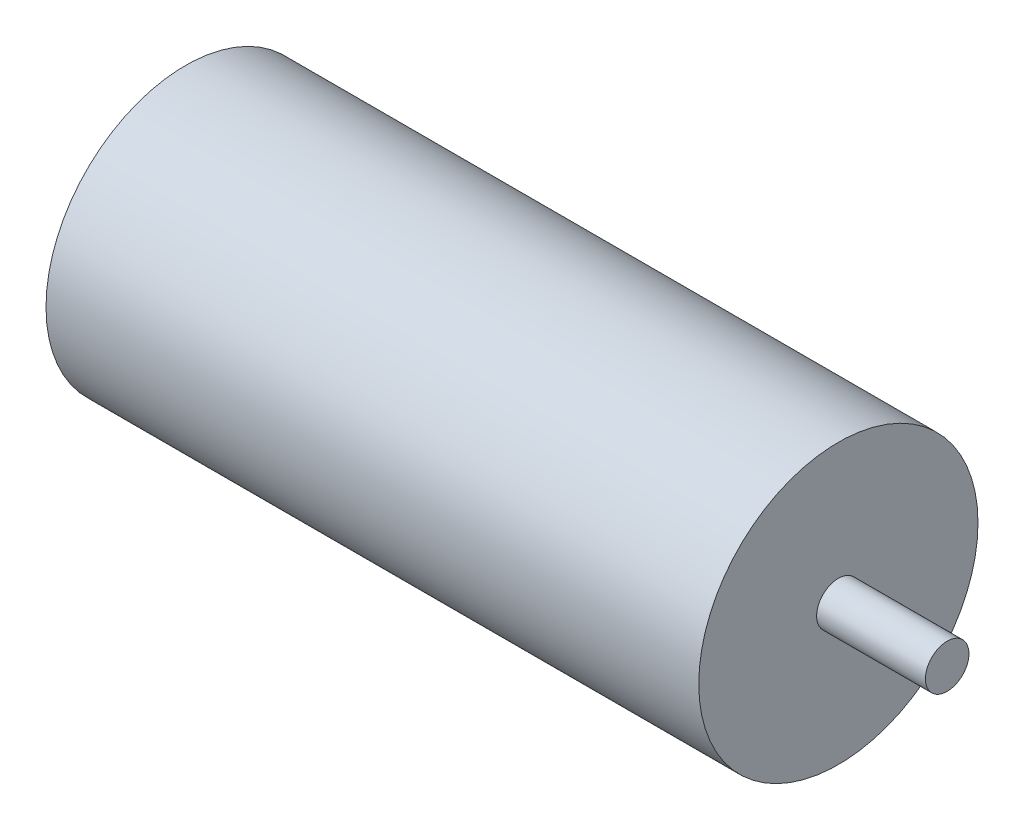
ISO-10303-21;
HEADER;
FILE_DESCRIPTION(('STEP AP214'),'2;1');
FILE_NAME('part.step','',(''),(''),'','','');
FILE_SCHEMA(('AUTOMOTIVE_DESIGN { 1 0 10303 214 1 1 1 1 }'));
ENDSEC;
DATA;
#1=APPLICATION_CONTEXT('core data for automotive mechanical design processes');
#2=APPLICATION_PROTOCOL_DEFINITION('international standard','automotive_design',2000,#1);
#3=PRODUCT_CONTEXT('',#1,'mechanical');
#4=PRODUCT('Part','Part','',(#3));
#5=PRODUCT_RELATED_PRODUCT_CATEGORY('part','',(#4));
#6=PRODUCT_DEFINITION_FORMATION('','',#4);
#7=PRODUCT_DEFINITION_CONTEXT('part definition',#1,'design');
#8=PRODUCT_DEFINITION('design','',#6,#7);
#9=PRODUCT_DEFINITION_SHAPE('','',#8);
#10=(LENGTH_UNIT() NAMED_UNIT(*) SI_UNIT(.MILLI.,.METRE.));
#11=(NAMED_UNIT(*) PLANE_ANGLE_UNIT() SI_UNIT($,.RADIAN.));
#12=(NAMED_UNIT(*) SI_UNIT($,.STERADIAN.) SOLID_ANGLE_UNIT());
#13=UNCERTAINTY_MEASURE_WITH_UNIT(LENGTH_MEASURE(1.E-05),#10,'distance_accuracy_value','');
#14=(GEOMETRIC_REPRESENTATION_CONTEXT(3) GLOBAL_UNCERTAINTY_ASSIGNED_CONTEXT((#13)) GLOBAL_UNIT_ASSIGNED_CONTEXT((#10,
#11,#12)) REPRESENTATION_CONTEXT('',''));
#15=CARTESIAN_POINT('',(0.,0.,0.));
#16=DIRECTION('',(0.,0.,1.));
#17=DIRECTION('',(1.,0.,0.));
#18=AXIS2_PLACEMENT_3D('',#15,#16,#17);
#19=CARTESIAN_POINT('',(180.,0.,0.));
#20=DIRECTION('',(-1.,0.,0.));
#21=DIRECTION('',(0.,0.,1.));
#22=AXIS2_PLACEMENT_3D('',#19,#20,#21);
#23=CYLINDRICAL_SURFACE('',#22,38.5);
#24=CARTESIAN_POINT('',(180.,0.,0.));
#25=DIRECTION('',(1.,0.,0.));
#26=DIRECTION('',(0.,0.,-1.));
#27=AXIS2_PLACEMENT_3D('',#24,#25,#26);
#28=CIRCLE('',#27,38.5);
#29=CARTESIAN_POINT('',(180.,0.,38.5));
#30=VERTEX_POINT('',#29);
#31=EDGE_CURVE('E10',#30,#30,#28,.T.);
#32=CARTESIAN_POINT('',(0.,0.,0.));
#33=DIRECTION('',(1.,0.,0.));
#34=DIRECTION('',(0.,0.,-1.));
#35=AXIS2_PLACEMENT_3D('',#32,#33,#34);
#36=CIRCLE('',#35,38.5);
#37=CARTESIAN_POINT('',(0.,0.,38.5));
#38=VERTEX_POINT('',#37);
#39=EDGE_CURVE('E40',#38,#38,#36,.T.);
#40=CARTESIAN_POINT('',(180.,0.,38.5));
#41=CARTESIAN_POINT('',(178.125,0.,38.5));
#42=CARTESIAN_POINT('',(176.25,0.,38.5));
#43=CARTESIAN_POINT('',(172.5,0.,38.5));
#44=CARTESIAN_POINT('',(170.625,0.,38.5));
#45=CARTESIAN_POINT('',(166.875,0.,38.5));
#46=CARTESIAN_POINT('',(165.,0.,38.5));
#47=CARTESIAN_POINT('',(161.25,0.,38.5));
#48=CARTESIAN_POINT('',(159.375,0.,38.5));
#49=CARTESIAN_POINT('',(155.625,0.,38.5));
#50=CARTESIAN_POINT('',(153.75,0.,38.5));
#51=CARTESIAN_POINT('',(150.,0.,38.5));
#52=CARTESIAN_POINT('',(148.125,0.,38.5));
#53=CARTESIAN_POINT('',(144.375,0.,38.5));
#54=CARTESIAN_POINT('',(142.5,0.,38.5));
#55=CARTESIAN_POINT('',(138.75,0.,38.5));
#56=CARTESIAN_POINT('',(136.875,0.,38.5));
#57=CARTESIAN_POINT('',(133.125,0.,38.5));
#58=CARTESIAN_POINT('',(131.25,0.,38.5));
#59=CARTESIAN_POINT('',(127.5,0.,38.5));
#60=CARTESIAN_POINT('',(125.625,0.,38.5));
#61=CARTESIAN_POINT('',(121.875,0.,38.5));
#62=CARTESIAN_POINT('',(120.,0.,38.5));
#63=CARTESIAN_POINT('',(116.25,0.,38.5));
#64=CARTESIAN_POINT('',(114.375,0.,38.5));
#65=CARTESIAN_POINT('',(110.625,0.,38.5));
#66=CARTESIAN_POINT('',(108.75,0.,38.5));
#67=CARTESIAN_POINT('',(105.,0.,38.5));
#68=CARTESIAN_POINT('',(103.125,0.,38.5));
#69=CARTESIAN_POINT('',(99.375,0.,38.5));
#70=CARTESIAN_POINT('',(97.5,0.,38.5));
#71=CARTESIAN_POINT('',(93.75,0.,38.5));
#72=CARTESIAN_POINT('',(91.875,0.,38.5));
#73=CARTESIAN_POINT('',(88.125,0.,38.5));
#74=CARTESIAN_POINT('',(86.25,0.,38.5));
#75=CARTESIAN_POINT('',(82.5,0.,38.5));
#76=CARTESIAN_POINT('',(80.625,0.,38.5));
#77=CARTESIAN_POINT('',(76.875,0.,38.5));
#78=CARTESIAN_POINT('',(75.,0.,38.5));
#79=CARTESIAN_POINT('',(71.25,0.,38.5));
#80=CARTESIAN_POINT('',(69.375,0.,38.5));
#81=CARTESIAN_POINT('',(65.625,0.,38.5));
#82=CARTESIAN_POINT('',(63.75,0.,38.5));
#83=CARTESIAN_POINT('',(60.,0.,38.5));
#84=CARTESIAN_POINT('',(58.125,0.,38.5));
#85=CARTESIAN_POINT('',(54.375,0.,38.5));
#86=CARTESIAN_POINT('',(52.5,0.,38.5));
#87=CARTESIAN_POINT('',(48.75,0.,38.5));
#88=CARTESIAN_POINT('',(46.875,0.,38.5));
#89=CARTESIAN_POINT('',(43.125,0.,38.5));
#90=CARTESIAN_POINT('',(41.25,0.,38.5));
#91=CARTESIAN_POINT('',(37.5,0.,38.5));
#92=CARTESIAN_POINT('',(35.625,0.,38.5));
#93=CARTESIAN_POINT('',(31.875,0.,38.5));
#94=CARTESIAN_POINT('',(30.,0.,38.5));
#95=CARTESIAN_POINT('',(26.25,0.,38.5));
#96=CARTESIAN_POINT('',(24.375,0.,38.5));
#97=CARTESIAN_POINT('',(20.625,0.,38.5));
#98=CARTESIAN_POINT('',(18.75,0.,38.5));
#99=CARTESIAN_POINT('',(15.,0.,38.5));
#100=CARTESIAN_POINT('',(13.125,0.,38.5));
#101=CARTESIAN_POINT('',(9.37499999999998,0.,38.5));
#102=CARTESIAN_POINT('',(7.49999999999997,0.,38.5));
#103=CARTESIAN_POINT('',(3.74999999999997,0.,38.5));
#104=CARTESIAN_POINT('',(1.87499999999997,0.,38.5));
#105=CARTESIAN_POINT('',(0.,0.,38.5));
#106=B_SPLINE_CURVE_WITH_KNOTS('',3,(#40,#41,#42,#43,#44,#45,#46,#47,#48,#49,#50,#51,#52,#53,
#54,#55,#56,#57,#58,#59,#60,#61,#62,#63,#64,#65,#66,#67,#68,#69,#70,#71,#72,#73,#74,#75,#76,#77,
#78,#79,#80,#81,#82,#83,#84,#85,#86,#87,#88,#89,#90,#91,#92,#93,#94,#95,#96,#97,#98,#99,#100,
#101,#102,#103,#104,#105),.UNSPECIFIED.,.F.,.F.,(4,2,2,2,2,2,2,2,2,2,2,2,2,2,2,2,2,2,2,2,2,2,2,
2,2,2,2,2,2,2,2,2,4),(0.,5.62500000000002,11.25,16.875,22.5,28.125,33.75,39.375,45.,50.625,
56.25,61.875,67.5,73.125,78.75,84.375,90.,95.625,101.25,106.875,112.5,118.125,123.75,129.375,
135.,140.625,146.25,151.875,157.5,163.125,168.75,174.375,180.),.UNSPECIFIED.);
#107=EDGE_CURVE('BSEAM37',#30,#38,#106,.T.);
#108=ORIENTED_EDGE('',*,*,#31,.F.);
#109=ORIENTED_EDGE('',*,*,#39,.T.);
#110=ORIENTED_EDGE('',*,*,#107,.T.);
#111=ORIENTED_EDGE('',*,*,#107,.F.);
#112=EDGE_LOOP('',(#108,#110,#109,#111));
#113=FACE_BOUND('',#112,.T.);
#114=ADVANCED_FACE('F37',(#113),#23,.T.);
#115=CARTESIAN_POINT('',(180.,0.,0.));
#116=DIRECTION('',(1.,0.,0.));
#117=DIRECTION('',(0.,0.,-1.));
#118=AXIS2_PLACEMENT_3D('',#115,#116,#117);
#119=PLANE('',#118);
#120=CARTESIAN_POINT('',(180.,0.,0.));
#121=DIRECTION('',(1.,0.,0.));
#122=DIRECTION('',(0.,0.,-1.));
#123=AXIS2_PLACEMENT_3D('',#120,#121,#122);
#124=CIRCLE('',#123,6.);
#125=CARTESIAN_POINT('',(180.,0.,-6.));
#126=VERTEX_POINT('',#125);
#127=EDGE_CURVE('E45',#126,#126,#124,.T.);
#128=ORIENTED_EDGE('',*,*,#127,.F.);
#129=EDGE_LOOP('',(#128));
#130=FACE_BOUND('',#129,.T.);
#131=ORIENTED_EDGE('',*,*,#31,.T.);
#132=EDGE_LOOP('',(#131));
#133=FACE_BOUND('',#132,.T.);
#134=ADVANCED_FACE('F82',(#130,#133),#119,.T.);
#135=CARTESIAN_POINT('',(0.,0.,0.));
#136=DIRECTION('',(1.,0.,0.));
#137=DIRECTION('',(0.,0.,-1.));
#138=AXIS2_PLACEMENT_3D('',#135,#136,#137);
#139=PLANE('',#138);
#140=CARTESIAN_POINT('',(0.,0.,0.));
#141=DIRECTION('',(1.,0.,0.));
#142=DIRECTION('',(0.,0.,-1.));
#143=AXIS2_PLACEMENT_3D('',#140,#141,#142);
#144=CIRCLE('',#143,6.);
#145=CARTESIAN_POINT('',(0.,0.,-6.));
#146=VERTEX_POINT('',#145);
#147=EDGE_CURVE('E52',#146,#146,#144,.T.);
#148=ORIENTED_EDGE('',*,*,#147,.T.);
#149=EDGE_LOOP('',(#148));
#150=FACE_BOUND('',#149,.T.);
#151=ORIENTED_EDGE('',*,*,#39,.F.);
#152=EDGE_LOOP('',(#151));
#153=FACE_BOUND('',#152,.T.);
#154=ADVANCED_FACE('F87',(#150,#153),#139,.F.);
#155=CARTESIAN_POINT('',(-15.,0.,0.));
#156=DIRECTION('',(1.,0.,0.));
#157=DIRECTION('',(0.,0.,-1.));
#158=AXIS2_PLACEMENT_3D('',#155,#156,#157);
#159=PLANE('',#158);
#160=CARTESIAN_POINT('',(-15.,0.,0.));
#161=DIRECTION('',(1.,0.,0.));
#162=DIRECTION('',(0.,0.,-1.));
#163=AXIS2_PLACEMENT_3D('',#160,#161,#162);
#164=CIRCLE('',#163,6.);
#165=CARTESIAN_POINT('',(-15.,0.,-6.));
#166=VERTEX_POINT('',#165);
#167=EDGE_CURVE('E56',#166,#166,#164,.T.);
#168=ORIENTED_EDGE('',*,*,#167,.F.);
#169=EDGE_LOOP('',(#168));
#170=FACE_BOUND('',#169,.T.);
#171=ADVANCED_FACE('F77',(#170),#159,.F.);
#172=CARTESIAN_POINT('',(-15.,0.,0.));
#173=DIRECTION('',(1.,0.,0.));
#174=DIRECTION('',(0.,0.,-1.));
#175=AXIS2_PLACEMENT_3D('',#172,#173,#174);
#176=CYLINDRICAL_SURFACE('',#175,6.);
#177=ORIENTED_EDGE('',*,*,#167,.T.);
#178=EDGE_LOOP('',(#177));
#179=FACE_BOUND('',#178,.T.);
#180=ORIENTED_EDGE('',*,*,#147,.F.);
#181=EDGE_LOOP('',(#180));
#182=FACE_BOUND('',#181,.T.);
#183=ADVANCED_FACE('F69',(#179,#182),#176,.T.);
#184=ORIENTED_EDGE('',*,*,#127,.T.);
#185=EDGE_LOOP('',(#184));
#186=FACE_BOUND('',#185,.T.);
#187=CARTESIAN_POINT('',(210.,0.,0.));
#188=DIRECTION('',(1.,0.,0.));
#189=DIRECTION('',(0.,0.,-1.));
#190=AXIS2_PLACEMENT_3D('',#187,#188,#189);
#191=CIRCLE('',#190,6.);
#192=CARTESIAN_POINT('',(210.,0.,-6.));
#193=VERTEX_POINT('',#192);
#194=EDGE_CURVE('E60',#193,#193,#191,.T.);
#195=ORIENTED_EDGE('',*,*,#194,.F.);
#196=EDGE_LOOP('',(#195));
#197=FACE_BOUND('',#196,.T.);
#198=ADVANCED_FACE('F67',(#186,#197),#176,.T.);
#199=CARTESIAN_POINT('',(210.,0.,0.));
#200=DIRECTION('',(1.,0.,0.));
#201=DIRECTION('',(0.,0.,-1.));
#202=AXIS2_PLACEMENT_3D('',#199,#200,#201);
#203=PLANE('',#202);
#204=ORIENTED_EDGE('',*,*,#194,.T.);
#205=EDGE_LOOP('',(#204));
#206=FACE_BOUND('',#205,.T.);
#207=ADVANCED_FACE('F65',(#206),#203,.T.);
#208=CLOSED_SHELL('',(#114,#134,#154,#171,#183,#198,#207));
#209=MANIFOLD_SOLID_BREP('B2',#208);
#210=ADVANCED_BREP_SHAPE_REPRESENTATION('',(#18,#209),#14);
#211=SHAPE_DEFINITION_REPRESENTATION(#9,#210);
ENDSEC;
END-ISO-10303-21;
